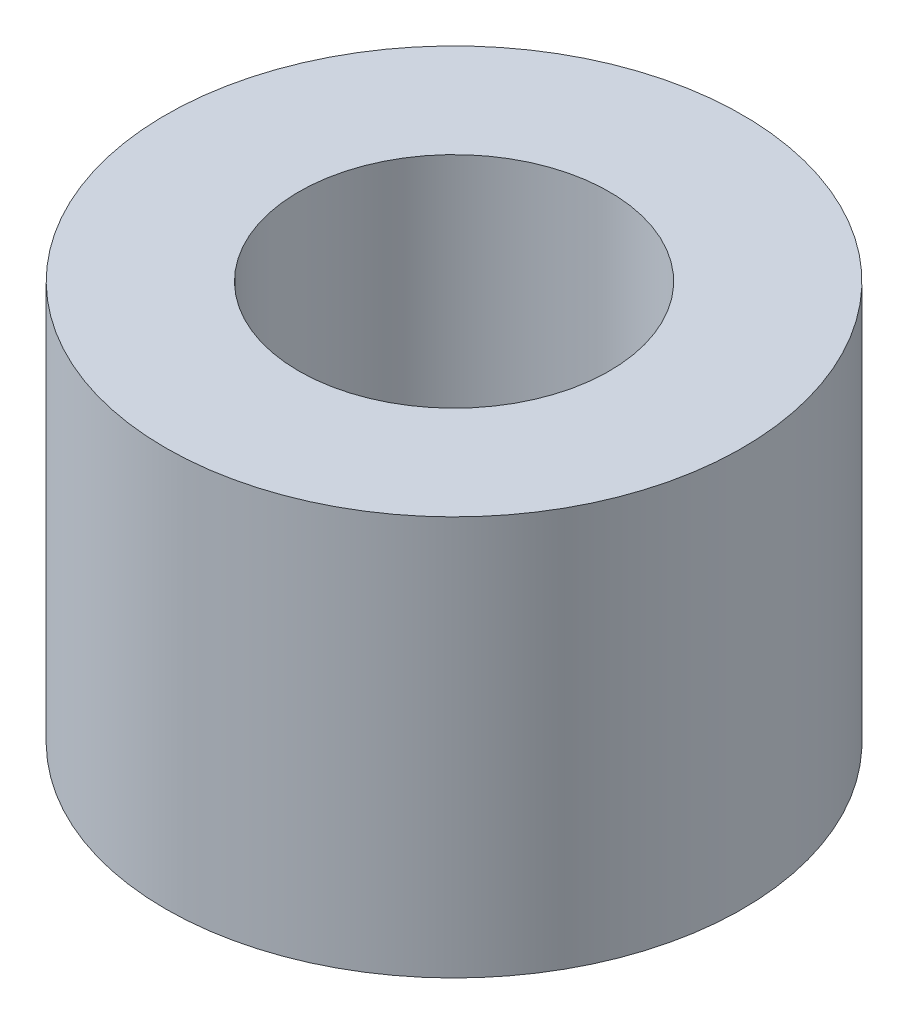
ISO-10303-21;
HEADER;
FILE_DESCRIPTION(('STEP AP214'),'2;1');
FILE_NAME('part.step','',(''),(''),'','','');
FILE_SCHEMA(('AUTOMOTIVE_DESIGN { 1 0 10303 214 1 1 1 1 }'));
ENDSEC;
DATA;
#1=APPLICATION_CONTEXT('core data for automotive mechanical design processes');
#2=APPLICATION_PROTOCOL_DEFINITION('international standard','automotive_design',2000,#1);
#3=PRODUCT_CONTEXT('',#1,'mechanical');
#4=PRODUCT('Part','Part','',(#3));
#5=PRODUCT_RELATED_PRODUCT_CATEGORY('part','',(#4));
#6=PRODUCT_DEFINITION_FORMATION('','',#4);
#7=PRODUCT_DEFINITION_CONTEXT('part definition',#1,'design');
#8=PRODUCT_DEFINITION('design','',#6,#7);
#9=PRODUCT_DEFINITION_SHAPE('','',#8);
#10=(LENGTH_UNIT() NAMED_UNIT(*) SI_UNIT(.MILLI.,.METRE.));
#11=(NAMED_UNIT(*) PLANE_ANGLE_UNIT() SI_UNIT($,.RADIAN.));
#12=(NAMED_UNIT(*) SI_UNIT($,.STERADIAN.) SOLID_ANGLE_UNIT());
#13=UNCERTAINTY_MEASURE_WITH_UNIT(LENGTH_MEASURE(1.E-05),#10,'distance_accuracy_value','');
#14=(GEOMETRIC_REPRESENTATION_CONTEXT(3) GLOBAL_UNCERTAINTY_ASSIGNED_CONTEXT((#13)) GLOBAL_UNIT_ASSIGNED_CONTEXT((#10,
#11,#12)) REPRESENTATION_CONTEXT('',''));
#15=CARTESIAN_POINT('',(0.,0.,0.));
#16=DIRECTION('',(0.,0.,1.));
#17=DIRECTION('',(1.,0.,0.));
#18=AXIS2_PLACEMENT_3D('',#15,#16,#17);
#19=CARTESIAN_POINT('',(0.,4.5,0.));
#20=DIRECTION('',(0.,1.,0.));
#21=DIRECTION('',(0.,0.,1.));
#22=AXIS2_PLACEMENT_3D('',#19,#20,#21);
#23=PLANE('',#22);
#24=CARTESIAN_POINT('',(0.,4.5,0.));
#25=DIRECTION('',(0.,1.,0.));
#26=DIRECTION('',(0.,0.,1.));
#27=AXIS2_PLACEMENT_3D('',#24,#25,#26);
#28=CIRCLE('',#27,3.25);
#29=CARTESIAN_POINT('',(0.,4.5,3.25));
#30=VERTEX_POINT('',#29);
#31=EDGE_CURVE('E10',#30,#30,#28,.T.);
#32=ORIENTED_EDGE('',*,*,#31,.T.);
#33=EDGE_LOOP('',(#32));
#34=FACE_BOUND('',#33,.T.);
#35=CARTESIAN_POINT('',(0.,4.5,0.));
#36=DIRECTION('',(0.,1.,0.));
#37=DIRECTION('',(0.,0.,1.));
#38=AXIS2_PLACEMENT_3D('',#35,#36,#37);
#39=CIRCLE('',#38,1.75);
#40=CARTESIAN_POINT('',(0.,4.5,1.75));
#41=VERTEX_POINT('',#40);
#42=EDGE_CURVE('E44',#41,#41,#39,.T.);
#43=ORIENTED_EDGE('',*,*,#42,.F.);
#44=EDGE_LOOP('',(#43));
#45=FACE_BOUND('',#44,.T.);
#46=ADVANCED_FACE('F33',(#34,#45),#23,.T.);
#47=CARTESIAN_POINT('',(0.,0.,0.));
#48=DIRECTION('',(0.,1.,0.));
#49=DIRECTION('',(0.,0.,1.));
#50=AXIS2_PLACEMENT_3D('',#47,#48,#49);
#51=PLANE('',#50);
#52=CARTESIAN_POINT('',(0.,0.,0.));
#53=DIRECTION('',(0.,1.,0.));
#54=DIRECTION('',(0.,0.,1.));
#55=AXIS2_PLACEMENT_3D('',#52,#53,#54);
#56=CIRCLE('',#55,3.25);
#57=CARTESIAN_POINT('',(0.,0.,3.25));
#58=VERTEX_POINT('',#57);
#59=EDGE_CURVE('E37',#58,#58,#56,.T.);
#60=ORIENTED_EDGE('',*,*,#59,.F.);
#61=EDGE_LOOP('',(#60));
#62=FACE_BOUND('',#61,.T.);
#63=CARTESIAN_POINT('',(0.,0.,0.));
#64=DIRECTION('',(0.,1.,0.));
#65=DIRECTION('',(0.,0.,1.));
#66=AXIS2_PLACEMENT_3D('',#63,#64,#65);
#67=CIRCLE('',#66,1.75);
#68=CARTESIAN_POINT('',(0.,0.,1.75));
#69=VERTEX_POINT('',#68);
#70=EDGE_CURVE('E46',#69,#69,#67,.T.);
#71=ORIENTED_EDGE('',*,*,#70,.T.);
#72=EDGE_LOOP('',(#71));
#73=FACE_BOUND('',#72,.T.);
#74=ADVANCED_FACE('F56',(#62,#73),#51,.F.);
#75=CARTESIAN_POINT('',(0.,4.5,0.));
#76=DIRECTION('',(0.,-1.,0.));
#77=DIRECTION('',(0.,0.,-1.));
#78=AXIS2_PLACEMENT_3D('',#75,#76,#77);
#79=CYLINDRICAL_SURFACE('',#78,3.25);
#80=ORIENTED_EDGE('',*,*,#31,.F.);
#81=EDGE_LOOP('',(#80));
#82=FACE_BOUND('',#81,.T.);
#83=ORIENTED_EDGE('',*,*,#59,.T.);
#84=EDGE_LOOP('',(#83));
#85=FACE_BOUND('',#84,.T.);
#86=ADVANCED_FACE('F35',(#82,#85),#79,.T.);
#87=CARTESIAN_POINT('',(0.,4.5,0.));
#88=DIRECTION('',(0.,-1.,0.));
#89=DIRECTION('',(0.,0.,-1.));
#90=AXIS2_PLACEMENT_3D('',#87,#88,#89);
#91=CYLINDRICAL_SURFACE('',#90,1.75);
#92=ORIENTED_EDGE('',*,*,#42,.T.);
#93=EDGE_LOOP('',(#92));
#94=FACE_BOUND('',#93,.T.);
#95=ORIENTED_EDGE('',*,*,#70,.F.);
#96=EDGE_LOOP('',(#95));
#97=FACE_BOUND('',#96,.T.);
#98=ADVANCED_FACE('F52',(#94,#97),#91,.F.);
#99=CLOSED_SHELL('',(#46,#74,#86,#98));
#100=MANIFOLD_SOLID_BREP('B2',#99);
#101=ADVANCED_BREP_SHAPE_REPRESENTATION('',(#18,#100),#14);
#102=SHAPE_DEFINITION_REPRESENTATION(#9,#101);
ENDSEC;
END-ISO-10303-21;
